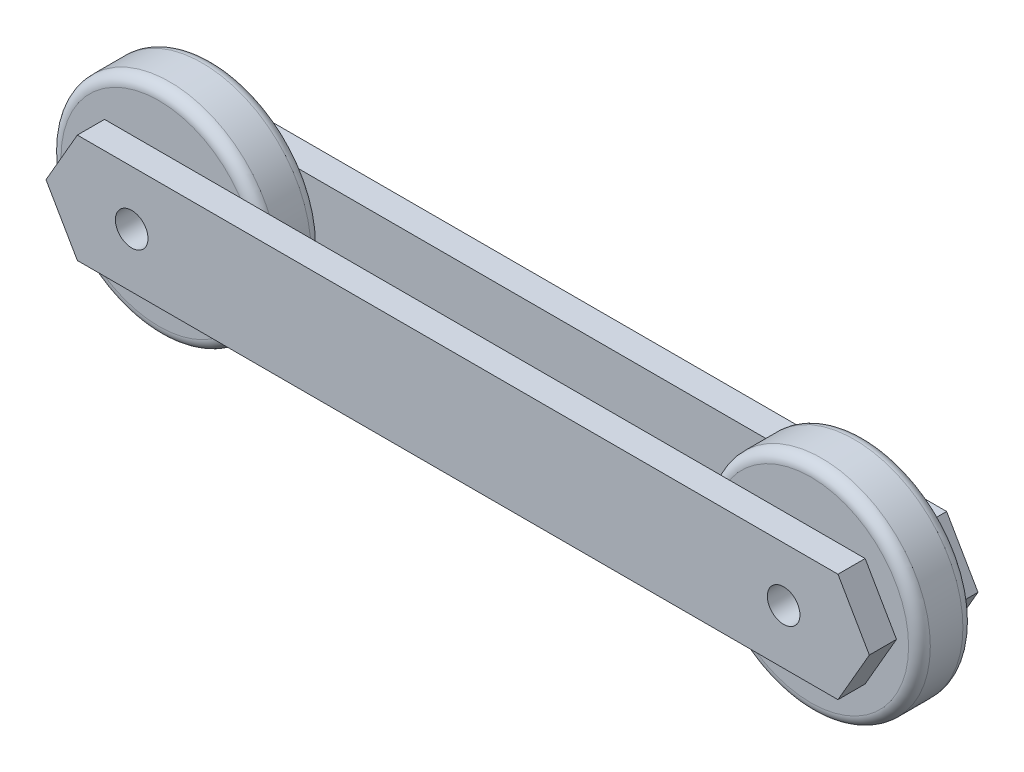
ISO-10303-21;
HEADER;
FILE_DESCRIPTION(('STEP AP214'),'2;1');
FILE_NAME('part.step','',(''),(''),'','','');
FILE_SCHEMA(('AUTOMOTIVE_DESIGN { 1 0 10303 214 1 1 1 1 }'));
ENDSEC;
DATA;
#1=APPLICATION_CONTEXT('core data for automotive mechanical design processes');
#2=APPLICATION_PROTOCOL_DEFINITION('international standard','automotive_design',2000,#1);
#3=PRODUCT_CONTEXT('',#1,'mechanical');
#4=PRODUCT('Part','Part','',(#3));
#5=PRODUCT_RELATED_PRODUCT_CATEGORY('part','',(#4));
#6=PRODUCT_DEFINITION_FORMATION('','',#4);
#7=PRODUCT_DEFINITION_CONTEXT('part definition',#1,'design');
#8=PRODUCT_DEFINITION('design','',#6,#7);
#9=PRODUCT_DEFINITION_SHAPE('','',#8);
#10=(LENGTH_UNIT() NAMED_UNIT(*) SI_UNIT(.MILLI.,.METRE.));
#11=(NAMED_UNIT(*) PLANE_ANGLE_UNIT() SI_UNIT($,.RADIAN.));
#12=(NAMED_UNIT(*) SI_UNIT($,.STERADIAN.) SOLID_ANGLE_UNIT());
#13=UNCERTAINTY_MEASURE_WITH_UNIT(LENGTH_MEASURE(1.E-05),#10,'distance_accuracy_value','');
#14=(GEOMETRIC_REPRESENTATION_CONTEXT(3) GLOBAL_UNCERTAINTY_ASSIGNED_CONTEXT((#13)) GLOBAL_UNIT_ASSIGNED_CONTEXT((#10,
#11,#12)) REPRESENTATION_CONTEXT('',''));
#15=CARTESIAN_POINT('',(0.,0.,0.));
#16=DIRECTION('',(0.,0.,1.));
#17=DIRECTION('',(1.,0.,0.));
#18=AXIS2_PLACEMENT_3D('',#15,#16,#17);
#19=CARTESIAN_POINT('',(-650.,50.0000000000047,-62.5));
#20=DIRECTION('',(0.,0.,1.));
#21=DIRECTION('',(1.,0.,0.));
#22=AXIS2_PLACEMENT_3D('',#19,#20,#21);
#23=CYLINDRICAL_SURFACE('',#22,100.);
#24=CARTESIAN_POINT('',(-650.,50.0000000000047,-22.5));
#25=DIRECTION('',(0.,0.,-1.));
#26=DIRECTION('',(-1.,0.,0.));
#27=AXIS2_PLACEMENT_3D('',#24,#25,#26);
#28=CIRCLE('',#27,100.);
#29=CARTESIAN_POINT('',(-750.,50.0000000000047,-22.5));
#30=VERTEX_POINT('',#29);
#31=EDGE_CURVE('E52',#30,#30,#28,.T.);
#32=ORIENTED_EDGE('',*,*,#31,.T.);
#33=EDGE_LOOP('',(#32));
#34=FACE_BOUND('',#33,.T.);
#35=CARTESIAN_POINT('',(-650.,50.0000000000047,-52.5));
#36=DIRECTION('',(0.,0.,-1.));
#37=DIRECTION('',(-1.,0.,0.));
#38=AXIS2_PLACEMENT_3D('',#35,#36,#37);
#39=CIRCLE('',#38,100.);
#40=CARTESIAN_POINT('',(-750.,50.0000000000047,-52.5));
#41=VERTEX_POINT('',#40);
#42=EDGE_CURVE('E56',#41,#41,#39,.F.);
#43=ORIENTED_EDGE('',*,*,#42,.T.);
#44=EDGE_LOOP('',(#43));
#45=FACE_BOUND('',#44,.T.);
#46=ADVANCED_FACE('F41',(#34,#45),#23,.T.);
#47=CARTESIAN_POINT('',(-650.,50.0000000000047,-62.5));
#48=DIRECTION('',(0.,0.,-1.));
#49=DIRECTION('',(-1.,0.,0.));
#50=AXIS2_PLACEMENT_3D('',#47,#48,#49);
#51=PLANE('',#50);
#52=CARTESIAN_POINT('',(-650.,50.0000000000047,-62.5));
#53=DIRECTION('',(0.,0.,-1.));
#54=DIRECTION('',(-1.,0.,0.));
#55=AXIS2_PLACEMENT_3D('',#52,#53,#54);
#56=CIRCLE('',#55,90.);
#57=CARTESIAN_POINT('',(-740.,50.0000000000047,-62.5));
#58=VERTEX_POINT('',#57);
#59=EDGE_CURVE('E11',#58,#58,#56,.T.);
#60=ORIENTED_EDGE('',*,*,#59,.T.);
#61=EDGE_LOOP('',(#60));
#62=FACE_BOUND('',#61,.T.);
#63=ADVANCED_FACE('F72',(#62),#51,.T.);
#64=CARTESIAN_POINT('',(-650.,50.0000000000047,-12.5));
#65=DIRECTION('',(0.,0.,-1.));
#66=DIRECTION('',(-1.,0.,0.));
#67=AXIS2_PLACEMENT_3D('',#64,#65,#66);
#68=PLANE('',#67);
#69=CARTESIAN_POINT('',(-650.,50.0000000000047,-12.5));
#70=DIRECTION('',(0.,0.,-1.));
#71=DIRECTION('',(-1.,0.,0.));
#72=AXIS2_PLACEMENT_3D('',#69,#70,#71);
#73=CIRCLE('',#72,90.);
#74=CARTESIAN_POINT('',(-740.,50.0000000000047,-12.5));
#75=VERTEX_POINT('',#74);
#76=EDGE_CURVE('E48',#75,#75,#73,.F.);
#77=ORIENTED_EDGE('',*,*,#76,.T.);
#78=EDGE_LOOP('',(#77));
#79=FACE_BOUND('',#78,.T.);
#80=ADVANCED_FACE('F69',(#79),#68,.F.);
#81=CARTESIAN_POINT('',(-650.,50.0000000000047,-22.5));
#82=DIRECTION('',(0.,0.,-1.));
#83=DIRECTION('',(-1.,0.,0.));
#84=AXIS2_PLACEMENT_3D('',#81,#82,#83);
#85=TOROIDAL_SURFACE('',#84,90.,10.);
#86=ORIENTED_EDGE('',*,*,#76,.F.);
#87=EDGE_LOOP('',(#86));
#88=FACE_BOUND('',#87,.T.);
#89=ORIENTED_EDGE('',*,*,#31,.F.);
#90=EDGE_LOOP('',(#89));
#91=FACE_BOUND('',#90,.T.);
#92=ADVANCED_FACE('F65',(#88,#91),#85,.T.);
#93=CARTESIAN_POINT('',(-650.,50.0000000000047,-52.5));
#94=DIRECTION('',(0.,0.,-1.));
#95=DIRECTION('',(-1.,0.,0.));
#96=AXIS2_PLACEMENT_3D('',#93,#94,#95);
#97=TOROIDAL_SURFACE('',#96,90.,10.);
#98=ORIENTED_EDGE('',*,*,#42,.F.);
#99=EDGE_LOOP('',(#98));
#100=FACE_BOUND('',#99,.T.);
#101=ORIENTED_EDGE('',*,*,#59,.F.);
#102=EDGE_LOOP('',(#101));
#103=FACE_BOUND('',#102,.T.);
#104=ADVANCED_FACE('F43',(#100,#103),#97,.T.);
#105=CLOSED_SHELL('',(#46,#63,#80,#92,#104));
#106=MANIFOLD_SOLID_BREP('B2',#105);
#107=CARTESIAN_POINT('',(-50.,50.0000000000047,-62.5));
#108=DIRECTION('',(0.,0.,1.));
#109=DIRECTION('',(1.,0.,0.));
#110=AXIS2_PLACEMENT_3D('',#107,#108,#109);
#111=CYLINDRICAL_SURFACE('',#110,100.);
#112=CARTESIAN_POINT('',(-50.,50.0000000000047,-22.5));
#113=DIRECTION('',(0.,0.,-1.));
#114=DIRECTION('',(-1.,0.,0.));
#115=AXIS2_PLACEMENT_3D('',#112,#113,#114);
#116=CIRCLE('',#115,100.);
#117=CARTESIAN_POINT('',(-150.,50.0000000000047,-22.5));
#118=VERTEX_POINT('',#117);
#119=EDGE_CURVE('E131',#118,#118,#116,.T.);
#120=ORIENTED_EDGE('',*,*,#119,.T.);
#121=EDGE_LOOP('',(#120));
#122=FACE_BOUND('',#121,.T.);
#123=CARTESIAN_POINT('',(-50.,50.0000000000047,-52.5));
#124=DIRECTION('',(0.,0.,-1.));
#125=DIRECTION('',(-1.,0.,0.));
#126=AXIS2_PLACEMENT_3D('',#123,#124,#125);
#127=CIRCLE('',#126,100.);
#128=CARTESIAN_POINT('',(-150.,50.0000000000047,-52.5));
#129=VERTEX_POINT('',#128);
#130=EDGE_CURVE('E135',#129,#129,#127,.F.);
#131=ORIENTED_EDGE('',*,*,#130,.T.);
#132=EDGE_LOOP('',(#131));
#133=FACE_BOUND('',#132,.T.);
#134=ADVANCED_FACE('F120',(#122,#133),#111,.T.);
#135=CARTESIAN_POINT('',(-50.,50.0000000000047,-62.5));
#136=DIRECTION('',(0.,0.,-1.));
#137=DIRECTION('',(-1.,0.,0.));
#138=AXIS2_PLACEMENT_3D('',#135,#136,#137);
#139=PLANE('',#138);
#140=CARTESIAN_POINT('',(-50.,50.0000000000047,-62.5));
#141=DIRECTION('',(0.,0.,-1.));
#142=DIRECTION('',(-1.,0.,0.));
#143=AXIS2_PLACEMENT_3D('',#140,#141,#142);
#144=CIRCLE('',#143,90.0000000000001);
#145=CARTESIAN_POINT('',(-140.,50.0000000000047,-62.5));
#146=VERTEX_POINT('',#145);
#147=EDGE_CURVE('E40',#146,#146,#144,.T.);
#148=ORIENTED_EDGE('',*,*,#147,.T.);
#149=EDGE_LOOP('',(#148));
#150=FACE_BOUND('',#149,.T.);
#151=ADVANCED_FACE('F151',(#150),#139,.T.);
#152=CARTESIAN_POINT('',(-50.,50.0000000000047,-12.5));
#153=DIRECTION('',(0.,0.,-1.));
#154=DIRECTION('',(-1.,0.,0.));
#155=AXIS2_PLACEMENT_3D('',#152,#153,#154);
#156=PLANE('',#155);
#157=CARTESIAN_POINT('',(-50.,50.0000000000047,-12.5));
#158=DIRECTION('',(0.,0.,-1.));
#159=DIRECTION('',(-1.,0.,0.));
#160=AXIS2_PLACEMENT_3D('',#157,#158,#159);
#161=CIRCLE('',#160,90.0000000000001);
#162=CARTESIAN_POINT('',(-140.,50.0000000000047,-12.5));
#163=VERTEX_POINT('',#162);
#164=EDGE_CURVE('E127',#163,#163,#161,.F.);
#165=ORIENTED_EDGE('',*,*,#164,.T.);
#166=EDGE_LOOP('',(#165));
#167=FACE_BOUND('',#166,.T.);
#168=ADVANCED_FACE('F148',(#167),#156,.F.);
#169=CARTESIAN_POINT('',(-50.,50.0000000000047,-22.5));
#170=DIRECTION('',(0.,0.,-1.));
#171=DIRECTION('',(-1.,0.,0.));
#172=AXIS2_PLACEMENT_3D('',#169,#170,#171);
#173=TOROIDAL_SURFACE('',#172,90.0000000000001,10.);
#174=ORIENTED_EDGE('',*,*,#164,.F.);
#175=EDGE_LOOP('',(#174));
#176=FACE_BOUND('',#175,.T.);
#177=ORIENTED_EDGE('',*,*,#119,.F.);
#178=EDGE_LOOP('',(#177));
#179=FACE_BOUND('',#178,.T.);
#180=ADVANCED_FACE('F144',(#176,#179),#173,.T.);
#181=CARTESIAN_POINT('',(-50.,50.0000000000047,-52.5));
#182=DIRECTION('',(0.,0.,-1.));
#183=DIRECTION('',(-1.,0.,0.));
#184=AXIS2_PLACEMENT_3D('',#181,#182,#183);
#185=TOROIDAL_SURFACE('',#184,90.0000000000001,10.);
#186=ORIENTED_EDGE('',*,*,#130,.F.);
#187=EDGE_LOOP('',(#186));
#188=FACE_BOUND('',#187,.T.);
#189=ORIENTED_EDGE('',*,*,#147,.F.);
#190=EDGE_LOOP('',(#189));
#191=FACE_BOUND('',#190,.T.);
#192=ADVANCED_FACE('F122',(#188,#191),#185,.T.);
#193=CLOSED_SHELL('',(#134,#151,#168,#180,#192));
#194=MANIFOLD_SOLID_BREP('B6',#193);
#195=CARTESIAN_POINT('',(0.,0.,-12.5));
#196=DIRECTION('',(0.86602540378444,-0.499999999999998,0.));
#197=DIRECTION('',(0.499999999999998,0.86602540378444,0.));
#198=AXIS2_PLACEMENT_3D('',#195,#196,#197);
#199=PLANE('',#198);
#200=DIRECTION('',(0.499999999999998,0.86602540378444,0.));
#201=VECTOR('',#200,1.);
#202=CARTESIAN_POINT('',(0.,0.,12.5));
#203=LINE('',#202,#201);
#204=CARTESIAN_POINT('',(0.,0.,12.5));
#205=VERTEX_POINT('',#204);
#206=CARTESIAN_POINT('',(28.8675134594838,50.0000000000047,12.5));
#207=VERTEX_POINT('',#206);
#208=EDGE_CURVE('E281',#205,#207,#203,.T.);
#209=ORIENTED_EDGE('',*,*,#208,.F.);
#210=DIRECTION('',(0.,0.,1.));
#211=VECTOR('',#210,1.);
#212=CARTESIAN_POINT('',(0.,0.,-12.5));
#213=LINE('',#212,#211);
#214=CARTESIAN_POINT('',(0.,0.,-12.5));
#215=VERTEX_POINT('',#214);
#216=EDGE_CURVE('E206',#215,#205,#213,.T.);
#217=ORIENTED_EDGE('',*,*,#216,.F.);
#218=DIRECTION('',(0.499999999999998,0.86602540378444,0.));
#219=VECTOR('',#218,1.);
#220=CARTESIAN_POINT('',(0.,0.,-12.5));
#221=LINE('',#220,#219);
#222=CARTESIAN_POINT('',(28.8675134594838,50.0000000000047,-12.5));
#223=VERTEX_POINT('',#222);
#224=EDGE_CURVE('E297',#215,#223,#221,.T.);
#225=ORIENTED_EDGE('',*,*,#224,.T.);
#226=DIRECTION('',(0.,0.,1.));
#227=VECTOR('',#226,1.);
#228=CARTESIAN_POINT('',(28.8675134594838,50.0000000000047,-12.5));
#229=LINE('',#228,#227);
#230=EDGE_CURVE('E242',#223,#207,#229,.T.);
#231=ORIENTED_EDGE('',*,*,#230,.T.);
#232=EDGE_LOOP('',(#209,#217,#225,#231));
#233=FACE_BOUND('',#232,.T.);
#234=ADVANCED_FACE('F190',(#233),#199,.T.);
#235=CARTESIAN_POINT('',(-700.,9.240148130911E-12,-12.5));
#236=DIRECTION('',(0.,-1.,0.));
#237=DIRECTION('',(1.,0.,0.));
#238=AXIS2_PLACEMENT_3D('',#235,#236,#237);
#239=PLANE('',#238);
#240=DIRECTION('',(1.,0.,0.));
#241=VECTOR('',#240,1.);
#242=CARTESIAN_POINT('',(-700.,9.240148130911E-12,12.5));
#243=LINE('',#242,#241);
#244=CARTESIAN_POINT('',(-700.,9.240148130911E-12,12.5));
#245=VERTEX_POINT('',#244);
#246=EDGE_CURVE('E294',#245,#205,#243,.T.);
#247=ORIENTED_EDGE('',*,*,#246,.F.);
#248=DIRECTION('',(0.,0.,1.));
#249=VECTOR('',#248,1.);
#250=CARTESIAN_POINT('',(-700.,9.240148130911E-12,-12.5));
#251=LINE('',#250,#249);
#252=CARTESIAN_POINT('',(-700.,9.240148130911E-12,-12.5));
#253=VERTEX_POINT('',#252);
#254=EDGE_CURVE('E230',#253,#245,#251,.T.);
#255=ORIENTED_EDGE('',*,*,#254,.F.);
#256=DIRECTION('',(1.,0.,0.));
#257=VECTOR('',#256,1.);
#258=CARTESIAN_POINT('',(-700.,9.240148130911E-12,-12.5));
#259=LINE('',#258,#257);
#260=EDGE_CURVE('E271',#253,#215,#259,.T.);
#261=ORIENTED_EDGE('',*,*,#260,.T.);
#262=ORIENTED_EDGE('',*,*,#216,.T.);
#263=EDGE_LOOP('',(#247,#255,#261,#262));
#264=FACE_BOUND('',#263,.T.);
#265=ADVANCED_FACE('F381',(#264),#239,.T.);
#266=CARTESIAN_POINT('',(-728.867513459482,50.0000000000092,-12.5));
#267=DIRECTION('',(-0.866025403784435,-0.500000000000007,0.));
#268=DIRECTION('',(0.500000000000007,-0.866025403784435,0.));
#269=AXIS2_PLACEMENT_3D('',#266,#267,#268);
#270=PLANE('',#269);
#271=DIRECTION('',(0.500000000000007,-0.866025403784435,0.));
#272=VECTOR('',#271,1.);
#273=CARTESIAN_POINT('',(-728.867513459482,50.0000000000092,12.5));
#274=LINE('',#273,#272);
#275=CARTESIAN_POINT('',(-728.867513459482,50.0000000000092,12.5));
#276=VERTEX_POINT('',#275);
#277=EDGE_CURVE('E258',#276,#245,#274,.T.);
#278=ORIENTED_EDGE('',*,*,#277,.F.);
#279=DIRECTION('',(0.,0.,1.));
#280=VECTOR('',#279,1.);
#281=CARTESIAN_POINT('',(-728.867513459482,50.0000000000092,-12.5));
#282=LINE('',#281,#280);
#283=CARTESIAN_POINT('',(-728.867513459482,50.0000000000092,-12.5));
#284=VERTEX_POINT('',#283);
#285=EDGE_CURVE('E253',#284,#276,#282,.T.);
#286=ORIENTED_EDGE('',*,*,#285,.F.);
#287=DIRECTION('',(0.500000000000007,-0.866025403784435,0.));
#288=VECTOR('',#287,1.);
#289=CARTESIAN_POINT('',(-728.867513459482,50.0000000000092,-12.5));
#290=LINE('',#289,#288);
#291=EDGE_CURVE('E256',#284,#253,#290,.T.);
#292=ORIENTED_EDGE('',*,*,#291,.T.);
#293=ORIENTED_EDGE('',*,*,#254,.T.);
#294=EDGE_LOOP('',(#278,#286,#292,#293));
#295=FACE_BOUND('',#294,.T.);
#296=ADVANCED_FACE('F255',(#295),#270,.T.);
#297=CARTESIAN_POINT('',(-700.,100.000000000009,-12.5));
#298=DIRECTION('',(-0.866025403784437,0.500000000000003,0.));
#299=DIRECTION('',(-0.500000000000003,-0.866025403784437,0.));
#300=AXIS2_PLACEMENT_3D('',#297,#298,#299);
#301=PLANE('',#300);
#302=DIRECTION('',(-0.500000000000003,-0.866025403784437,0.));
#303=VECTOR('',#302,1.);
#304=CARTESIAN_POINT('',(-700.,100.000000000009,12.5));
#305=LINE('',#304,#303);
#306=CARTESIAN_POINT('',(-700.,100.000000000009,12.5));
#307=VERTEX_POINT('',#306);
#308=EDGE_CURVE('E291',#307,#276,#305,.T.);
#309=ORIENTED_EDGE('',*,*,#308,.F.);
#310=DIRECTION('',(0.,0.,1.));
#311=VECTOR('',#310,1.);
#312=CARTESIAN_POINT('',(-700.,100.000000000009,-12.5));
#313=LINE('',#312,#311);
#314=CARTESIAN_POINT('',(-700.,100.000000000009,-12.5));
#315=VERTEX_POINT('',#314);
#316=EDGE_CURVE('E263',#315,#307,#313,.T.);
#317=ORIENTED_EDGE('',*,*,#316,.F.);
#318=DIRECTION('',(-0.500000000000003,-0.866025403784437,0.));
#319=VECTOR('',#318,1.);
#320=CARTESIAN_POINT('',(-700.,100.000000000009,-12.5));
#321=LINE('',#320,#319);
#322=EDGE_CURVE('E269',#315,#284,#321,.T.);
#323=ORIENTED_EDGE('',*,*,#322,.T.);
#324=ORIENTED_EDGE('',*,*,#285,.T.);
#325=EDGE_LOOP('',(#309,#317,#323,#324));
#326=FACE_BOUND('',#325,.T.);
#327=ADVANCED_FACE('F273',(#326),#301,.T.);
#328=CARTESIAN_POINT('',(0.,100.000000000009,-12.5));
#329=DIRECTION('',(0.,1.,0.));
#330=DIRECTION('',(-1.,0.,0.));
#331=AXIS2_PLACEMENT_3D('',#328,#329,#330);
#332=PLANE('',#331);
#333=DIRECTION('',(-1.,0.,0.));
#334=VECTOR('',#333,1.);
#335=CARTESIAN_POINT('',(0.,100.000000000009,12.5));
#336=LINE('',#335,#334);
#337=CARTESIAN_POINT('',(0.,100.000000000009,12.5));
#338=VERTEX_POINT('',#337);
#339=EDGE_CURVE('E288',#338,#307,#336,.T.);
#340=ORIENTED_EDGE('',*,*,#339,.F.);
#341=DIRECTION('',(0.,0.,1.));
#342=VECTOR('',#341,1.);
#343=CARTESIAN_POINT('',(0.,100.000000000009,-12.5));
#344=LINE('',#343,#342);
#345=CARTESIAN_POINT('',(0.,100.000000000009,-12.5));
#346=VERTEX_POINT('',#345);
#347=EDGE_CURVE('E302',#346,#338,#344,.T.);
#348=ORIENTED_EDGE('',*,*,#347,.F.);
#349=DIRECTION('',(-1.,0.,0.));
#350=VECTOR('',#349,1.);
#351=CARTESIAN_POINT('',(0.,100.000000000009,-12.5));
#352=LINE('',#351,#350);
#353=EDGE_CURVE('E274',#346,#315,#352,.T.);
#354=ORIENTED_EDGE('',*,*,#353,.T.);
#355=ORIENTED_EDGE('',*,*,#316,.T.);
#356=EDGE_LOOP('',(#340,#348,#354,#355));
#357=FACE_BOUND('',#356,.T.);
#358=ADVANCED_FACE('F394',(#357),#332,.T.);
#359=CARTESIAN_POINT('',(28.8675134594838,50.0000000000047,-12.5));
#360=DIRECTION('',(0.866025403784439,0.499999999999999,0.));
#361=DIRECTION('',(-0.499999999999999,0.866025403784439,0.));
#362=AXIS2_PLACEMENT_3D('',#359,#360,#361);
#363=PLANE('',#362);
#364=DIRECTION('',(-0.499999999999999,0.866025403784439,0.));
#365=VECTOR('',#364,1.);
#366=CARTESIAN_POINT('',(28.8675134594838,50.0000000000047,12.5));
#367=LINE('',#366,#365);
#368=EDGE_CURVE('E284',#207,#338,#367,.T.);
#369=ORIENTED_EDGE('',*,*,#368,.F.);
#370=ORIENTED_EDGE('',*,*,#230,.F.);
#371=DIRECTION('',(-0.499999999999999,0.866025403784439,0.));
#372=VECTOR('',#371,1.);
#373=CARTESIAN_POINT('',(28.8675134594838,50.0000000000047,-12.5));
#374=LINE('',#373,#372);
#375=EDGE_CURVE('E276',#223,#346,#374,.T.);
#376=ORIENTED_EDGE('',*,*,#375,.T.);
#377=ORIENTED_EDGE('',*,*,#347,.T.);
#378=EDGE_LOOP('',(#369,#370,#376,#377));
#379=FACE_BOUND('',#378,.T.);
#380=ADVANCED_FACE('F377',(#379),#363,.T.);
#381=CARTESIAN_POINT('',(0.,0.,-12.5));
#382=DIRECTION('',(0.,0.,1.));
#383=DIRECTION('',(1.,0.,0.));
#384=AXIS2_PLACEMENT_3D('',#381,#382,#383);
#385=PLANE('',#384);
#386=CARTESIAN_POINT('',(-50.,50.0000000000047,-12.5));
#387=DIRECTION('',(0.,0.,1.));
#388=DIRECTION('',(1.,0.,0.));
#389=AXIS2_PLACEMENT_3D('',#386,#387,#388);
#390=CIRCLE('',#389,40.);
#391=CARTESIAN_POINT('',(-10.,50.0000000000047,-12.5));
#392=VERTEX_POINT('',#391);
#393=EDGE_CURVE('E118',#392,#392,#390,.F.);
#394=ORIENTED_EDGE('',*,*,#393,.F.);
#395=EDGE_LOOP('',(#394));
#396=FACE_BOUND('',#395,.T.);
#397=CARTESIAN_POINT('',(-650.,50.0000000000047,-12.5));
#398=DIRECTION('',(0.,0.,1.));
#399=DIRECTION('',(1.,0.,0.));
#400=AXIS2_PLACEMENT_3D('',#397,#398,#399);
#401=CIRCLE('',#400,40.);
#402=CARTESIAN_POINT('',(-610.,50.0000000000047,-12.5));
#403=VERTEX_POINT('',#402);
#404=EDGE_CURVE('E299',#403,#403,#401,.F.);
#405=ORIENTED_EDGE('',*,*,#404,.F.);
#406=EDGE_LOOP('',(#405));
#407=FACE_BOUND('',#406,.T.);
#408=ORIENTED_EDGE('',*,*,#224,.F.);
#409=ORIENTED_EDGE('',*,*,#260,.F.);
#410=ORIENTED_EDGE('',*,*,#291,.F.);
#411=ORIENTED_EDGE('',*,*,#322,.F.);
#412=ORIENTED_EDGE('',*,*,#353,.F.);
#413=ORIENTED_EDGE('',*,*,#375,.F.);
#414=EDGE_LOOP('',(#408,#409,#410,#411,#412,#413));
#415=FACE_BOUND('',#414,.T.);
#416=ADVANCED_FACE('F267',(#396,#407,#415),#385,.F.);
#417=CARTESIAN_POINT('',(0.,0.,12.5));
#418=DIRECTION('',(0.,0.,1.));
#419=DIRECTION('',(1.,0.,0.));
#420=AXIS2_PLACEMENT_3D('',#417,#418,#419);
#421=PLANE('',#420);
#422=CARTESIAN_POINT('',(-50.,50.0000000000047,12.5));
#423=DIRECTION('',(0.,0.,1.));
#424=DIRECTION('',(1.,0.,0.));
#425=AXIS2_PLACEMENT_3D('',#422,#423,#424);
#426=CIRCLE('',#425,15.);
#427=CARTESIAN_POINT('',(-35.,50.0000000000047,12.5));
#428=VERTEX_POINT('',#427);
#429=EDGE_CURVE('E365',#428,#428,#426,.T.);
#430=ORIENTED_EDGE('',*,*,#429,.F.);
#431=EDGE_LOOP('',(#430));
#432=FACE_BOUND('',#431,.T.);
#433=CARTESIAN_POINT('',(-650.,50.0000000000047,12.5));
#434=DIRECTION('',(0.,0.,1.));
#435=DIRECTION('',(1.,0.,0.));
#436=AXIS2_PLACEMENT_3D('',#433,#434,#435);
#437=CIRCLE('',#436,15.);
#438=CARTESIAN_POINT('',(-635.,50.0000000000047,12.5));
#439=VERTEX_POINT('',#438);
#440=EDGE_CURVE('E370',#439,#439,#437,.T.);
#441=ORIENTED_EDGE('',*,*,#440,.F.);
#442=EDGE_LOOP('',(#441));
#443=FACE_BOUND('',#442,.T.);
#444=ORIENTED_EDGE('',*,*,#208,.T.);
#445=ORIENTED_EDGE('',*,*,#368,.T.);
#446=ORIENTED_EDGE('',*,*,#339,.T.);
#447=ORIENTED_EDGE('',*,*,#308,.T.);
#448=ORIENTED_EDGE('',*,*,#277,.T.);
#449=ORIENTED_EDGE('',*,*,#246,.T.);
#450=EDGE_LOOP('',(#444,#445,#446,#447,#448,#449));
#451=FACE_BOUND('',#450,.T.);
#452=ADVANCED_FACE('F380',(#432,#443,#451),#421,.T.);
#453=CARTESIAN_POINT('',(-650.,50.0000000000047,-12.5));
#454=DIRECTION('',(0.,0.,1.));
#455=DIRECTION('',(1.,0.,0.));
#456=AXIS2_PLACEMENT_3D('',#453,#454,#455);
#457=CYLINDRICAL_SURFACE('',#456,15.);
#458=CARTESIAN_POINT('',(-650.,50.0000000000047,-12.5));
#459=DIRECTION('',(0.,0.,1.));
#460=DIRECTION('',(1.,0.,0.));
#461=AXIS2_PLACEMENT_3D('',#458,#459,#460);
#462=CIRCLE('',#461,15.);
#463=CARTESIAN_POINT('',(-635.,50.0000000000047,-12.5));
#464=VERTEX_POINT('',#463);
#465=EDGE_CURVE('E285',#464,#464,#462,.T.);
#466=ORIENTED_EDGE('',*,*,#465,.F.);
#467=EDGE_LOOP('',(#466));
#468=FACE_BOUND('',#467,.T.);
#469=ORIENTED_EDGE('',*,*,#440,.T.);
#470=EDGE_LOOP('',(#469));
#471=FACE_BOUND('',#470,.T.);
#472=ADVANCED_FACE('F405',(#468,#471),#457,.F.);
#473=CARTESIAN_POINT('',(-50.,50.0000000000047,-12.5));
#474=DIRECTION('',(0.,0.,1.));
#475=DIRECTION('',(1.,0.,0.));
#476=AXIS2_PLACEMENT_3D('',#473,#474,#475);
#477=CYLINDRICAL_SURFACE('',#476,15.);
#478=CARTESIAN_POINT('',(-50.,50.0000000000047,-12.5));
#479=DIRECTION('',(0.,0.,1.));
#480=DIRECTION('',(1.,0.,0.));
#481=AXIS2_PLACEMENT_3D('',#478,#479,#480);
#482=CIRCLE('',#481,15.);
#483=CARTESIAN_POINT('',(-35.,50.0000000000047,-12.5));
#484=VERTEX_POINT('',#483);
#485=EDGE_CURVE('E367',#484,#484,#482,.T.);
#486=ORIENTED_EDGE('',*,*,#485,.F.);
#487=EDGE_LOOP('',(#486));
#488=FACE_BOUND('',#487,.T.);
#489=ORIENTED_EDGE('',*,*,#429,.T.);
#490=EDGE_LOOP('',(#489));
#491=FACE_BOUND('',#490,.T.);
#492=ADVANCED_FACE('F412',(#488,#491),#477,.F.);
#493=CARTESIAN_POINT('',(0.,0.,-12.5));
#494=DIRECTION('',(0.,0.,1.));
#495=DIRECTION('',(1.,0.,0.));
#496=AXIS2_PLACEMENT_3D('',#493,#494,#495);
#497=PLANE('',#496);
#498=ORIENTED_EDGE('',*,*,#465,.T.);
#499=EDGE_LOOP('',(#498));
#500=FACE_BOUND('',#499,.T.);
#501=ADVANCED_FACE('F416',(#500),#497,.T.);
#502=CARTESIAN_POINT('',(-650.,50.0000000000047,100.637084989848));
#503=DIRECTION('',(0.,0.,-1.));
#504=DIRECTION('',(-1.,0.,0.));
#505=AXIS2_PLACEMENT_3D('',#502,#503,#504);
#506=CYLINDRICAL_SURFACE('',#505,40.);
#507=CARTESIAN_POINT('',(-650.,50.0000000000047,-62.5));
#508=DIRECTION('',(0.,0.,-1.));
#509=DIRECTION('',(-1.,0.,0.));
#510=AXIS2_PLACEMENT_3D('',#507,#508,#509);
#511=CIRCLE('',#510,40.);
#512=CARTESIAN_POINT('',(-690.,50.0000000000047,-62.5));
#513=VERTEX_POINT('',#512);
#514=EDGE_CURVE('E324',#513,#513,#511,.T.);
#515=ORIENTED_EDGE('',*,*,#514,.F.);
#516=EDGE_LOOP('',(#515));
#517=FACE_BOUND('',#516,.T.);
#518=ORIENTED_EDGE('',*,*,#404,.T.);
#519=EDGE_LOOP('',(#518));
#520=FACE_BOUND('',#519,.T.);
#521=ADVANCED_FACE('F420',(#517,#520),#506,.T.);
#522=CARTESIAN_POINT('',(0.,0.,-62.5));
#523=DIRECTION('',(0.86602540378444,-0.499999999999998,0.));
#524=DIRECTION('',(0.499999999999998,0.86602540378444,0.));
#525=AXIS2_PLACEMENT_3D('',#522,#523,#524);
#526=PLANE('',#525);
#527=DIRECTION('',(0.499999999999998,0.86602540378444,0.));
#528=VECTOR('',#527,1.);
#529=CARTESIAN_POINT('',(0.,0.,-87.5));
#530=LINE('',#529,#528);
#531=CARTESIAN_POINT('',(0.,0.,-87.5));
#532=VERTEX_POINT('',#531);
#533=CARTESIAN_POINT('',(28.8675134594838,50.0000000000047,-87.5));
#534=VERTEX_POINT('',#533);
#535=EDGE_CURVE('E352',#532,#534,#530,.T.);
#536=ORIENTED_EDGE('',*,*,#535,.T.);
#537=DIRECTION('',(0.,0.,-1.));
#538=VECTOR('',#537,1.);
#539=CARTESIAN_POINT('',(28.8675134594838,50.0000000000047,-62.5));
#540=LINE('',#539,#538);
#541=CARTESIAN_POINT('',(28.8675134594838,50.0000000000047,-62.5));
#542=VERTEX_POINT('',#541);
#543=EDGE_CURVE('E348',#542,#534,#540,.T.);
#544=ORIENTED_EDGE('',*,*,#543,.F.);
#545=DIRECTION('',(0.499999999999998,0.86602540378444,0.));
#546=VECTOR('',#545,1.);
#547=CARTESIAN_POINT('',(0.,0.,-62.5));
#548=LINE('',#547,#546);
#549=CARTESIAN_POINT('',(0.,0.,-62.5));
#550=VERTEX_POINT('',#549);
#551=EDGE_CURVE('E330',#550,#542,#548,.T.);
#552=ORIENTED_EDGE('',*,*,#551,.F.);
#553=DIRECTION('',(0.,0.,-1.));
#554=VECTOR('',#553,1.);
#555=CARTESIAN_POINT('',(0.,0.,-62.5));
#556=LINE('',#555,#554);
#557=EDGE_CURVE('E366',#550,#532,#556,.T.);
#558=ORIENTED_EDGE('',*,*,#557,.T.);
#559=EDGE_LOOP('',(#536,#544,#552,#558));
#560=FACE_BOUND('',#559,.T.);
#561=ADVANCED_FACE('F349',(#560),#526,.T.);
#562=CARTESIAN_POINT('',(-700.,9.240148130911E-12,-62.5));
#563=DIRECTION('',(0.,-1.,0.));
#564=DIRECTION('',(1.,0.,0.));
#565=AXIS2_PLACEMENT_3D('',#562,#563,#564);
#566=PLANE('',#565);
#567=DIRECTION('',(1.,0.,0.));
#568=VECTOR('',#567,1.);
#569=CARTESIAN_POINT('',(-700.,9.240148130911E-12,-87.5));
#570=LINE('',#569,#568);
#571=CARTESIAN_POINT('',(-700.,9.240148130911E-12,-87.5));
#572=VERTEX_POINT('',#571);
#573=EDGE_CURVE('E344',#572,#532,#570,.T.);
#574=ORIENTED_EDGE('',*,*,#573,.T.);
#575=ORIENTED_EDGE('',*,*,#557,.F.);
#576=DIRECTION('',(1.,0.,0.));
#577=VECTOR('',#576,1.);
#578=CARTESIAN_POINT('',(-700.,9.240148130911E-12,-62.5));
#579=LINE('',#578,#577);
#580=CARTESIAN_POINT('',(-700.,9.240148130911E-12,-62.5));
#581=VERTEX_POINT('',#580);
#582=EDGE_CURVE('E339',#581,#550,#579,.T.);
#583=ORIENTED_EDGE('',*,*,#582,.F.);
#584=DIRECTION('',(0.,0.,-1.));
#585=VECTOR('',#584,1.);
#586=CARTESIAN_POINT('',(-700.,9.240148130911E-12,-62.5));
#587=LINE('',#586,#585);
#588=EDGE_CURVE('E504',#581,#572,#587,.T.);
#589=ORIENTED_EDGE('',*,*,#588,.T.);
#590=EDGE_LOOP('',(#574,#575,#583,#589));
#591=FACE_BOUND('',#590,.T.);
#592=ADVANCED_FACE('F433',(#591),#566,.T.);
#593=CARTESIAN_POINT('',(-728.867513459482,50.0000000000092,-62.5));
#594=DIRECTION('',(-0.866025403784435,-0.500000000000007,0.));
#595=DIRECTION('',(0.500000000000007,-0.866025403784435,0.));
#596=AXIS2_PLACEMENT_3D('',#593,#594,#595);
#597=PLANE('',#596);
#598=DIRECTION('',(0.500000000000007,-0.866025403784435,0.));
#599=VECTOR('',#598,1.);
#600=CARTESIAN_POINT('',(-728.867513459482,50.0000000000092,-87.5));
#601=LINE('',#600,#599);
#602=CARTESIAN_POINT('',(-728.867513459482,50.0000000000092,-87.5));
#603=VERTEX_POINT('',#602);
#604=EDGE_CURVE('E498',#603,#572,#601,.T.);
#605=ORIENTED_EDGE('',*,*,#604,.T.);
#606=ORIENTED_EDGE('',*,*,#588,.F.);
#607=DIRECTION('',(0.500000000000007,-0.866025403784435,0.));
#608=VECTOR('',#607,1.);
#609=CARTESIAN_POINT('',(-728.867513459482,50.0000000000092,-62.5));
#610=LINE('',#609,#608);
#611=CARTESIAN_POINT('',(-728.867513459482,50.0000000000092,-62.5));
#612=VERTEX_POINT('',#611);
#613=EDGE_CURVE('E360',#612,#581,#610,.T.);
#614=ORIENTED_EDGE('',*,*,#613,.F.);
#615=DIRECTION('',(0.,0.,-1.));
#616=VECTOR('',#615,1.);
#617=CARTESIAN_POINT('',(-728.867513459482,50.0000000000092,-62.5));
#618=LINE('',#617,#616);
#619=EDGE_CURVE('E507',#612,#603,#618,.T.);
#620=ORIENTED_EDGE('',*,*,#619,.T.);
#621=EDGE_LOOP('',(#605,#606,#614,#620));
#622=FACE_BOUND('',#621,.T.);
#623=ADVANCED_FACE('F443',(#622),#597,.T.);
#624=CARTESIAN_POINT('',(-700.,100.000000000009,-62.5));
#625=DIRECTION('',(-0.866025403784437,0.500000000000003,0.));
#626=DIRECTION('',(-0.500000000000003,-0.866025403784437,0.));
#627=AXIS2_PLACEMENT_3D('',#624,#625,#626);
#628=PLANE('',#627);
#629=DIRECTION('',(-0.500000000000003,-0.866025403784437,0.));
#630=VECTOR('',#629,1.);
#631=CARTESIAN_POINT('',(-700.,100.000000000009,-87.5));
#632=LINE('',#631,#630);
#633=CARTESIAN_POINT('',(-700.,100.000000000009,-87.5));
#634=VERTEX_POINT('',#633);
#635=EDGE_CURVE('E495',#634,#603,#632,.T.);
#636=ORIENTED_EDGE('',*,*,#635,.T.);
#637=ORIENTED_EDGE('',*,*,#619,.F.);
#638=DIRECTION('',(-0.500000000000003,-0.866025403784437,0.));
#639=VECTOR('',#638,1.);
#640=CARTESIAN_POINT('',(-700.,100.000000000009,-62.5));
#641=LINE('',#640,#639);
#642=CARTESIAN_POINT('',(-700.,100.000000000009,-62.5));
#643=VERTEX_POINT('',#642);
#644=EDGE_CURVE('E485',#643,#612,#641,.T.);
#645=ORIENTED_EDGE('',*,*,#644,.F.);
#646=DIRECTION('',(0.,0.,-1.));
#647=VECTOR('',#646,1.);
#648=CARTESIAN_POINT('',(-700.,100.000000000009,-62.5));
#649=LINE('',#648,#647);
#650=EDGE_CURVE('E358',#643,#634,#649,.T.);
#651=ORIENTED_EDGE('',*,*,#650,.T.);
#652=EDGE_LOOP('',(#636,#637,#645,#651));
#653=FACE_BOUND('',#652,.T.);
#654=ADVANCED_FACE('F439',(#653),#628,.T.);
#655=CARTESIAN_POINT('',(0.,100.000000000009,-62.5));
#656=DIRECTION('',(0.,1.,0.));
#657=DIRECTION('',(-1.,0.,0.));
#658=AXIS2_PLACEMENT_3D('',#655,#656,#657);
#659=PLANE('',#658);
#660=DIRECTION('',(-1.,0.,0.));
#661=VECTOR('',#660,1.);
#662=CARTESIAN_POINT('',(0.,100.000000000009,-87.5));
#663=LINE('',#662,#661);
#664=CARTESIAN_POINT('',(0.,100.000000000009,-87.5));
#665=VERTEX_POINT('',#664);
#666=EDGE_CURVE('E492',#665,#634,#663,.T.);
#667=ORIENTED_EDGE('',*,*,#666,.T.);
#668=ORIENTED_EDGE('',*,*,#650,.F.);
#669=DIRECTION('',(-1.,0.,0.));
#670=VECTOR('',#669,1.);
#671=CARTESIAN_POINT('',(0.,100.000000000009,-62.5));
#672=LINE('',#671,#670);
#673=CARTESIAN_POINT('',(0.,100.000000000009,-62.5));
#674=VERTEX_POINT('',#673);
#675=EDGE_CURVE('E483',#674,#643,#672,.T.);
#676=ORIENTED_EDGE('',*,*,#675,.F.);
#677=DIRECTION('',(0.,0.,-1.));
#678=VECTOR('',#677,1.);
#679=CARTESIAN_POINT('',(0.,100.000000000009,-62.5));
#680=LINE('',#679,#678);
#681=EDGE_CURVE('E355',#674,#665,#680,.T.);
#682=ORIENTED_EDGE('',*,*,#681,.T.);
#683=EDGE_LOOP('',(#667,#668,#676,#682));
#684=FACE_BOUND('',#683,.T.);
#685=ADVANCED_FACE('F436',(#684),#659,.T.);
#686=CARTESIAN_POINT('',(28.8675134594838,50.0000000000047,-62.5));
#687=DIRECTION('',(0.866025403784439,0.499999999999999,0.));
#688=DIRECTION('',(-0.499999999999999,0.866025403784439,0.));
#689=AXIS2_PLACEMENT_3D('',#686,#687,#688);
#690=PLANE('',#689);
#691=DIRECTION('',(-0.499999999999999,0.866025403784439,0.));
#692=VECTOR('',#691,1.);
#693=CARTESIAN_POINT('',(28.8675134594838,50.0000000000047,-87.5));
#694=LINE('',#693,#692);
#695=EDGE_CURVE('E490',#534,#665,#694,.T.);
#696=ORIENTED_EDGE('',*,*,#695,.T.);
#697=ORIENTED_EDGE('',*,*,#681,.F.);
#698=DIRECTION('',(-0.499999999999999,0.866025403784439,0.));
#699=VECTOR('',#698,1.);
#700=CARTESIAN_POINT('',(28.8675134594838,50.0000000000047,-62.5));
#701=LINE('',#700,#699);
#702=EDGE_CURVE('E335',#542,#674,#701,.T.);
#703=ORIENTED_EDGE('',*,*,#702,.F.);
#704=ORIENTED_EDGE('',*,*,#543,.T.);
#705=EDGE_LOOP('',(#696,#697,#703,#704));
#706=FACE_BOUND('',#705,.T.);
#707=ADVANCED_FACE('F319',(#706),#690,.T.);
#708=CARTESIAN_POINT('',(0.,0.,-62.5));
#709=DIRECTION('',(0.,0.,-1.));
#710=DIRECTION('',(1.,0.,0.));
#711=AXIS2_PLACEMENT_3D('',#708,#709,#710);
#712=PLANE('',#711);
#713=CARTESIAN_POINT('',(-50.,50.0000000000047,-62.5));
#714=DIRECTION('',(0.,0.,-1.));
#715=DIRECTION('',(-1.,0.,0.));
#716=AXIS2_PLACEMENT_3D('',#713,#714,#715);
#717=CIRCLE('',#716,40.);
#718=CARTESIAN_POINT('',(-90.0000000000001,50.0000000000047,-62.5));
#719=VERTEX_POINT('',#718);
#720=EDGE_CURVE('E198',#719,#719,#717,.F.);
#721=ORIENTED_EDGE('',*,*,#720,.F.);
#722=EDGE_LOOP('',(#721));
#723=FACE_BOUND('',#722,.T.);
#724=ORIENTED_EDGE('',*,*,#514,.T.);
#725=EDGE_LOOP('',(#724));
#726=FACE_BOUND('',#725,.T.);
#727=ORIENTED_EDGE('',*,*,#551,.T.);
#728=ORIENTED_EDGE('',*,*,#702,.T.);
#729=ORIENTED_EDGE('',*,*,#675,.T.);
#730=ORIENTED_EDGE('',*,*,#644,.T.);
#731=ORIENTED_EDGE('',*,*,#613,.T.);
#732=ORIENTED_EDGE('',*,*,#582,.T.);
#733=EDGE_LOOP('',(#727,#728,#729,#730,#731,#732));
#734=FACE_BOUND('',#733,.T.);
#735=ADVANCED_FACE('F315',(#723,#726,#734),#712,.F.);
#736=CARTESIAN_POINT('',(0.,0.,-87.5));
#737=DIRECTION('',(0.,0.,-1.));
#738=DIRECTION('',(1.,0.,0.));
#739=AXIS2_PLACEMENT_3D('',#736,#737,#738);
#740=PLANE('',#739);
#741=CARTESIAN_POINT('',(-50.,50.0000000000047,-87.5));
#742=DIRECTION('',(0.,0.,1.));
#743=DIRECTION('',(1.,0.,0.));
#744=AXIS2_PLACEMENT_3D('',#741,#742,#743);
#745=CIRCLE('',#744,15.);
#746=CARTESIAN_POINT('',(-35.,50.0000000000047,-87.5));
#747=VERTEX_POINT('',#746);
#748=EDGE_CURVE('E474',#747,#747,#745,.T.);
#749=ORIENTED_EDGE('',*,*,#748,.T.);
#750=EDGE_LOOP('',(#749));
#751=FACE_BOUND('',#750,.T.);
#752=CARTESIAN_POINT('',(-650.,50.0000000000047,-87.5));
#753=DIRECTION('',(0.,0.,1.));
#754=DIRECTION('',(1.,0.,0.));
#755=AXIS2_PLACEMENT_3D('',#752,#753,#754);
#756=CIRCLE('',#755,15.);
#757=CARTESIAN_POINT('',(-635.,50.0000000000047,-87.5));
#758=VERTEX_POINT('',#757);
#759=EDGE_CURVE('E477',#758,#758,#756,.T.);
#760=ORIENTED_EDGE('',*,*,#759,.T.);
#761=EDGE_LOOP('',(#760));
#762=FACE_BOUND('',#761,.T.);
#763=ORIENTED_EDGE('',*,*,#535,.F.);
#764=ORIENTED_EDGE('',*,*,#573,.F.);
#765=ORIENTED_EDGE('',*,*,#604,.F.);
#766=ORIENTED_EDGE('',*,*,#635,.F.);
#767=ORIENTED_EDGE('',*,*,#666,.F.);
#768=ORIENTED_EDGE('',*,*,#695,.F.);
#769=EDGE_LOOP('',(#763,#764,#765,#766,#767,#768));
#770=FACE_BOUND('',#769,.T.);
#771=ADVANCED_FACE('F318',(#751,#762,#770),#740,.T.);
#772=CARTESIAN_POINT('',(-650.,50.0000000000047,-62.5));
#773=DIRECTION('',(0.,0.,-1.));
#774=DIRECTION('',(1.,0.,0.));
#775=AXIS2_PLACEMENT_3D('',#772,#773,#774);
#776=CYLINDRICAL_SURFACE('',#775,15.);
#777=CARTESIAN_POINT('',(-650.,50.0000000000047,-62.5));
#778=DIRECTION('',(0.,0.,1.));
#779=DIRECTION('',(1.,0.,0.));
#780=AXIS2_PLACEMENT_3D('',#777,#778,#779);
#781=CIRCLE('',#780,15.);
#782=CARTESIAN_POINT('',(-635.,50.0000000000047,-62.5));
#783=VERTEX_POINT('',#782);
#784=EDGE_CURVE('E307',#783,#783,#781,.T.);
#785=ORIENTED_EDGE('',*,*,#784,.T.);
#786=EDGE_LOOP('',(#785));
#787=FACE_BOUND('',#786,.T.);
#788=ORIENTED_EDGE('',*,*,#759,.F.);
#789=EDGE_LOOP('',(#788));
#790=FACE_BOUND('',#789,.T.);
#791=ADVANCED_FACE('F452',(#787,#790),#776,.F.);
#792=CARTESIAN_POINT('',(-50.,50.0000000000047,-62.5));
#793=DIRECTION('',(0.,0.,-1.));
#794=DIRECTION('',(1.,0.,0.));
#795=AXIS2_PLACEMENT_3D('',#792,#793,#794);
#796=CYLINDRICAL_SURFACE('',#795,15.);
#797=CARTESIAN_POINT('',(-50.,50.0000000000047,-62.5));
#798=DIRECTION('',(0.,0.,1.));
#799=DIRECTION('',(1.,0.,0.));
#800=AXIS2_PLACEMENT_3D('',#797,#798,#799);
#801=CIRCLE('',#800,15.);
#802=CARTESIAN_POINT('',(-35.,50.0000000000047,-62.5));
#803=VERTEX_POINT('',#802);
#804=EDGE_CURVE('E473',#803,#803,#801,.F.);
#805=ORIENTED_EDGE('',*,*,#804,.F.);
#806=EDGE_LOOP('',(#805));
#807=FACE_BOUND('',#806,.T.);
#808=ORIENTED_EDGE('',*,*,#748,.F.);
#809=EDGE_LOOP('',(#808));
#810=FACE_BOUND('',#809,.T.);
#811=ADVANCED_FACE('F429',(#807,#810),#796,.F.);
#812=CARTESIAN_POINT('',(-650.,50.0000000000047,-62.5));
#813=DIRECTION('',(0.,0.,1.));
#814=DIRECTION('',(1.,0.,0.));
#815=AXIS2_PLACEMENT_3D('',#812,#813,#814);
#816=PLANE('',#815);
#817=ORIENTED_EDGE('',*,*,#784,.F.);
#818=EDGE_LOOP('',(#817));
#819=FACE_BOUND('',#818,.T.);
#820=ADVANCED_FACE('F425',(#819),#816,.F.);
#821=CARTESIAN_POINT('',(-50.,50.0000000000047,-62.5));
#822=DIRECTION('',(0.,0.,1.));
#823=DIRECTION('',(1.,0.,0.));
#824=AXIS2_PLACEMENT_3D('',#821,#822,#823);
#825=PLANE('',#824);
#826=ORIENTED_EDGE('',*,*,#804,.T.);
#827=EDGE_LOOP('',(#826));
#828=FACE_BOUND('',#827,.T.);
#829=ADVANCED_FACE('F428',(#828),#825,.F.);
#830=CARTESIAN_POINT('',(-50.,50.0000000000047,100.637084989848));
#831=DIRECTION('',(0.,0.,-1.));
#832=DIRECTION('',(-1.,0.,0.));
#833=AXIS2_PLACEMENT_3D('',#830,#831,#832);
#834=CYLINDRICAL_SURFACE('',#833,40.);
#835=ORIENTED_EDGE('',*,*,#720,.T.);
#836=EDGE_LOOP('',(#835));
#837=FACE_BOUND('',#836,.T.);
#838=ORIENTED_EDGE('',*,*,#393,.T.);
#839=EDGE_LOOP('',(#838));
#840=FACE_BOUND('',#839,.T.);
#841=ADVANCED_FACE('F312',(#837,#840),#834,.T.);
#842=CARTESIAN_POINT('',(0.,0.,-12.5));
#843=DIRECTION('',(0.,0.,1.));
#844=DIRECTION('',(1.,0.,0.));
#845=AXIS2_PLACEMENT_3D('',#842,#843,#844);
#846=PLANE('',#845);
#847=ORIENTED_EDGE('',*,*,#485,.T.);
#848=EDGE_LOOP('',(#847));
#849=FACE_BOUND('',#848,.T.);
#850=ADVANCED_FACE('F461',(#849),#846,.T.);
#851=CLOSED_SHELL('',(#234,#265,#296,#327,#358,#380,#416,#452,#472,#492,#501,#521,#561,#592,
#623,#654,#685,#707,#735,#771,#791,#811,#820,#829,#841,#850));
#852=MANIFOLD_SOLID_BREP('B35',#851);
#853=ADVANCED_BREP_SHAPE_REPRESENTATION('',(#18,#106,#194,#852),#14);
#854=SHAPE_DEFINITION_REPRESENTATION(#9,#853);
ENDSEC;
END-ISO-10303-21;
